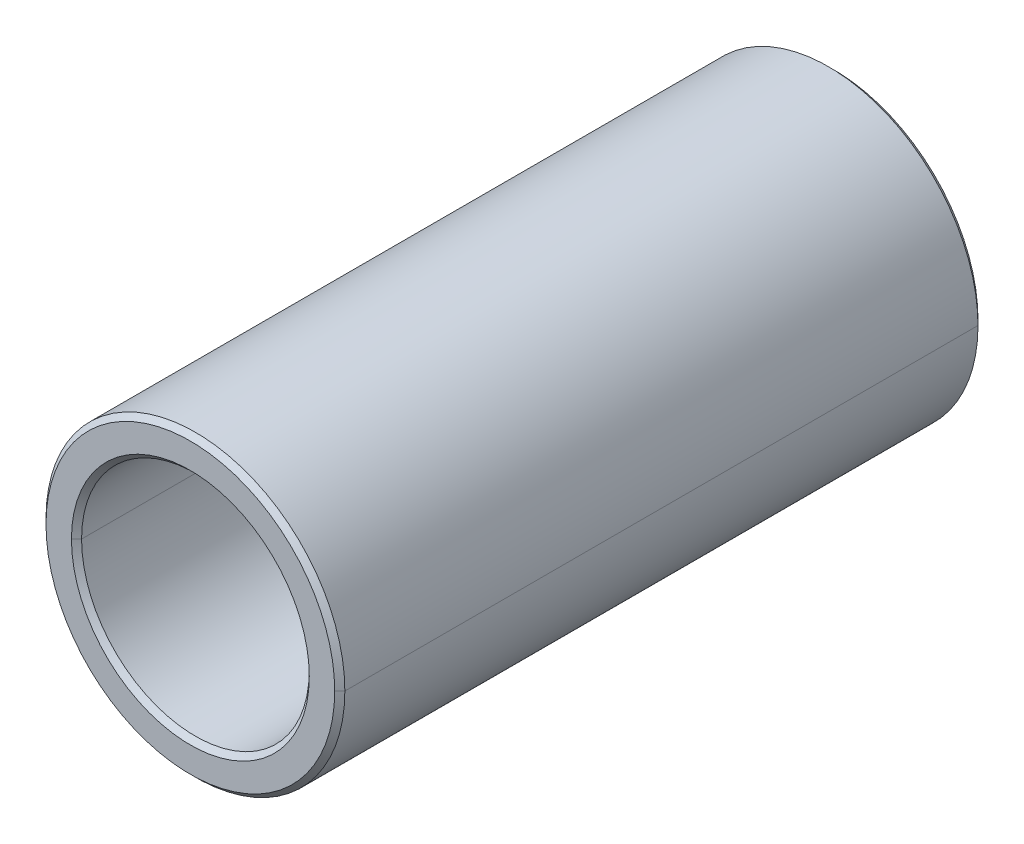
ISO-10303-21;
HEADER;
FILE_DESCRIPTION(('STEP AP214'),'2;1');
FILE_NAME('part.step','',(''),(''),'','','');
FILE_SCHEMA(('AUTOMOTIVE_DESIGN { 1 0 10303 214 1 1 1 1 }'));
ENDSEC;
DATA;
#1=APPLICATION_CONTEXT('core data for automotive mechanical design processes');
#2=APPLICATION_PROTOCOL_DEFINITION('international standard','automotive_design',2000,#1);
#3=PRODUCT_CONTEXT('',#1,'mechanical');
#4=PRODUCT('Part','Part','',(#3));
#5=PRODUCT_RELATED_PRODUCT_CATEGORY('part','',(#4));
#6=PRODUCT_DEFINITION_FORMATION('','',#4);
#7=PRODUCT_DEFINITION_CONTEXT('part definition',#1,'design');
#8=PRODUCT_DEFINITION('design','',#6,#7);
#9=PRODUCT_DEFINITION_SHAPE('','',#8);
#10=(LENGTH_UNIT() NAMED_UNIT(*) SI_UNIT(.MILLI.,.METRE.));
#11=(NAMED_UNIT(*) PLANE_ANGLE_UNIT() SI_UNIT($,.RADIAN.));
#12=(NAMED_UNIT(*) SI_UNIT($,.STERADIAN.) SOLID_ANGLE_UNIT());
#13=UNCERTAINTY_MEASURE_WITH_UNIT(LENGTH_MEASURE(1.E-05),#10,'distance_accuracy_value','');
#14=(GEOMETRIC_REPRESENTATION_CONTEXT(3) GLOBAL_UNCERTAINTY_ASSIGNED_CONTEXT((#13)) GLOBAL_UNIT_ASSIGNED_CONTEXT((#10,
#11,#12)) REPRESENTATION_CONTEXT('',''));
#15=CARTESIAN_POINT('',(0.,0.,0.));
#16=DIRECTION('',(0.,0.,1.));
#17=DIRECTION('',(1.,0.,0.));
#18=AXIS2_PLACEMENT_3D('',#15,#16,#17);
#19=CARTESIAN_POINT('',(0.,0.,6.35));
#20=DIRECTION('',(0.,0.,-1.));
#21=DIRECTION('',(-1.,0.,0.));
#22=AXIS2_PLACEMENT_3D('',#19,#20,#21);
#23=CONICAL_SURFACE('',#22,2.85,0.785398163397459);
#24=DIRECTION('',(0.707106781186555,0.,-0.70710678118654));
#25=VECTOR('',#24,1.);
#26=CARTESIAN_POINT('',(2.85,0.,6.35));
#27=LINE('',#26,#25);
#28=CARTESIAN_POINT('',(2.85,0.,6.35));
#29=VERTEX_POINT('',#28);
#30=CARTESIAN_POINT('',(2.95,0.,6.25));
#31=VERTEX_POINT('',#30);
#32=EDGE_CURVE('E174',#29,#31,#27,.T.);
#33=ORIENTED_EDGE('',*,*,#32,.F.);
#34=CARTESIAN_POINT('',(0.,0.,6.35));
#35=DIRECTION('',(0.,0.,1.));
#36=DIRECTION('',(-1.,0.,0.));
#37=AXIS2_PLACEMENT_3D('',#34,#35,#36);
#38=CIRCLE('',#37,2.85);
#39=CARTESIAN_POINT('',(-2.85,0.,6.35));
#40=VERTEX_POINT('',#39);
#41=EDGE_CURVE('E183',#40,#29,#38,.T.);
#42=ORIENTED_EDGE('',*,*,#41,.F.);
#43=DIRECTION('',(-0.707106781186555,0.,-0.70710678118654));
#44=VECTOR('',#43,1.);
#45=CARTESIAN_POINT('',(-2.85,0.,6.35));
#46=LINE('',#45,#44);
#47=CARTESIAN_POINT('',(-2.95,0.,6.25));
#48=VERTEX_POINT('',#47);
#49=EDGE_CURVE('E152',#40,#48,#46,.T.);
#50=ORIENTED_EDGE('',*,*,#49,.T.);
#51=CARTESIAN_POINT('',(0.,0.,6.25));
#52=DIRECTION('',(0.,0.,-1.));
#53=DIRECTION('',(-1.,0.,0.));
#54=AXIS2_PLACEMENT_3D('',#51,#52,#53);
#55=CIRCLE('',#54,2.95);
#56=EDGE_CURVE('E11',#31,#48,#55,.T.);
#57=ORIENTED_EDGE('',*,*,#56,.F.);
#58=EDGE_LOOP('',(#33,#42,#50,#57));
#59=FACE_BOUND('',#58,.T.);
#60=ADVANCED_FACE('F17',(#59),#23,.T.);
#61=CARTESIAN_POINT('',(0.,0.,6.25));
#62=DIRECTION('',(0.,0.,1.));
#63=DIRECTION('',(1.,0.,0.));
#64=AXIS2_PLACEMENT_3D('',#61,#62,#63);
#65=CONICAL_SURFACE('',#64,2.2479,0.785398163397452);
#66=DIRECTION('',(-0.707106781186551,0.,0.707106781186545));
#67=VECTOR('',#66,1.);
#68=CARTESIAN_POINT('',(-2.2479,0.,6.25));
#69=LINE('',#68,#67);
#70=CARTESIAN_POINT('',(-2.2479,0.,6.25));
#71=VERTEX_POINT('',#70);
#72=CARTESIAN_POINT('',(-2.3479,0.,6.35));
#73=VERTEX_POINT('',#72);
#74=EDGE_CURVE('E184',#71,#73,#69,.T.);
#75=ORIENTED_EDGE('',*,*,#74,.F.);
#76=CARTESIAN_POINT('',(0.,0.,6.25));
#77=DIRECTION('',(0.,0.,1.));
#78=DIRECTION('',(-1.,0.,0.));
#79=AXIS2_PLACEMENT_3D('',#76,#77,#78);
#80=CIRCLE('',#79,2.2479);
#81=CARTESIAN_POINT('',(2.2479,0.,6.25));
#82=VERTEX_POINT('',#81);
#83=EDGE_CURVE('E172',#82,#71,#80,.T.);
#84=ORIENTED_EDGE('',*,*,#83,.F.);
#85=DIRECTION('',(0.707106781186551,0.,0.707106781186545));
#86=VECTOR('',#85,1.);
#87=CARTESIAN_POINT('',(2.2479,0.,6.25));
#88=LINE('',#87,#86);
#89=CARTESIAN_POINT('',(2.3479,0.,6.35));
#90=VERTEX_POINT('',#89);
#91=EDGE_CURVE('E140',#82,#90,#88,.T.);
#92=ORIENTED_EDGE('',*,*,#91,.T.);
#93=CARTESIAN_POINT('',(0.,0.,6.35));
#94=DIRECTION('',(0.,0.,-1.));
#95=DIRECTION('',(-1.,0.,0.));
#96=AXIS2_PLACEMENT_3D('',#93,#94,#95);
#97=CIRCLE('',#96,2.3479);
#98=EDGE_CURVE('E179',#73,#90,#97,.T.);
#99=ORIENTED_EDGE('',*,*,#98,.F.);
#100=EDGE_LOOP('',(#75,#84,#92,#99));
#101=FACE_BOUND('',#100,.T.);
#102=ADVANCED_FACE('F352',(#101),#65,.F.);
#103=CARTESIAN_POINT('',(0.,0.,-6.25));
#104=DIRECTION('',(0.,0.,1.));
#105=DIRECTION('',(1.,0.,0.));
#106=AXIS2_PLACEMENT_3D('',#103,#104,#105);
#107=CONICAL_SURFACE('',#106,2.95,0.785398163397443);
#108=DIRECTION('',(-0.707106781186545,0.,0.707106781186551));
#109=VECTOR('',#108,1.);
#110=CARTESIAN_POINT('',(-2.95,0.,-6.25));
#111=LINE('',#110,#109);
#112=CARTESIAN_POINT('',(-2.85,0.,-6.35));
#113=VERTEX_POINT('',#112);
#114=CARTESIAN_POINT('',(-2.95,0.,-6.25));
#115=VERTEX_POINT('',#114);
#116=EDGE_CURVE('E109',#113,#115,#111,.T.);
#117=ORIENTED_EDGE('',*,*,#116,.F.);
#118=CARTESIAN_POINT('',(0.,0.,-6.35));
#119=DIRECTION('',(0.,0.,-1.));
#120=DIRECTION('',(1.,0.,0.));
#121=AXIS2_PLACEMENT_3D('',#118,#119,#120);
#122=CIRCLE('',#121,2.85);
#123=CARTESIAN_POINT('',(2.85,0.,-6.35));
#124=VERTEX_POINT('',#123);
#125=EDGE_CURVE('E148',#124,#113,#122,.T.);
#126=ORIENTED_EDGE('',*,*,#125,.F.);
#127=DIRECTION('',(0.707106781186545,0.,0.707106781186551));
#128=VECTOR('',#127,1.);
#129=CARTESIAN_POINT('',(2.95,0.,-6.25));
#130=LINE('',#129,#128);
#131=CARTESIAN_POINT('',(2.95,0.,-6.25));
#132=VERTEX_POINT('',#131);
#133=EDGE_CURVE('E112',#124,#132,#130,.T.);
#134=ORIENTED_EDGE('',*,*,#133,.T.);
#135=CARTESIAN_POINT('',(0.,0.,-6.25));
#136=DIRECTION('',(0.,0.,1.));
#137=DIRECTION('',(1.,0.,0.));
#138=AXIS2_PLACEMENT_3D('',#135,#136,#137);
#139=CIRCLE('',#138,2.95);
#140=EDGE_CURVE('E28',#115,#132,#139,.T.);
#141=ORIENTED_EDGE('',*,*,#140,.F.);
#142=EDGE_LOOP('',(#117,#126,#134,#141));
#143=FACE_BOUND('',#142,.T.);
#144=ADVANCED_FACE('F107',(#143),#107,.T.);
#145=CARTESIAN_POINT('',(0.,0.,-6.35));
#146=DIRECTION('',(0.,0.,-1.));
#147=DIRECTION('',(-1.,0.,0.));
#148=AXIS2_PLACEMENT_3D('',#145,#146,#147);
#149=CONICAL_SURFACE('',#148,2.3479,0.785398163397443);
#150=DIRECTION('',(0.707106781186545,0.,-0.707106781186551));
#151=VECTOR('',#150,1.);
#152=CARTESIAN_POINT('',(2.3479,0.,-6.35));
#153=LINE('',#152,#151);
#154=CARTESIAN_POINT('',(2.2479,0.,-6.25));
#155=VERTEX_POINT('',#154);
#156=CARTESIAN_POINT('',(2.3479,0.,-6.35));
#157=VERTEX_POINT('',#156);
#158=EDGE_CURVE('E164',#155,#157,#153,.T.);
#159=ORIENTED_EDGE('',*,*,#158,.F.);
#160=CARTESIAN_POINT('',(0.,0.,-6.25));
#161=DIRECTION('',(0.,0.,-1.));
#162=DIRECTION('',(1.,0.,0.));
#163=AXIS2_PLACEMENT_3D('',#160,#161,#162);
#164=CIRCLE('',#163,2.2479);
#165=CARTESIAN_POINT('',(-2.2479,0.,-6.25));
#166=VERTEX_POINT('',#165);
#167=EDGE_CURVE('E182',#166,#155,#164,.T.);
#168=ORIENTED_EDGE('',*,*,#167,.F.);
#169=DIRECTION('',(-0.707106781186545,0.,-0.707106781186551));
#170=VECTOR('',#169,1.);
#171=CARTESIAN_POINT('',(-2.3479,0.,-6.35));
#172=LINE('',#171,#170);
#173=CARTESIAN_POINT('',(-2.3479,0.,-6.35));
#174=VERTEX_POINT('',#173);
#175=EDGE_CURVE('E124',#166,#174,#172,.T.);
#176=ORIENTED_EDGE('',*,*,#175,.T.);
#177=CARTESIAN_POINT('',(0.,0.,-6.35));
#178=DIRECTION('',(0.,0.,1.));
#179=DIRECTION('',(1.,0.,0.));
#180=AXIS2_PLACEMENT_3D('',#177,#178,#179);
#181=CIRCLE('',#180,2.3479);
#182=EDGE_CURVE('E42',#157,#174,#181,.T.);
#183=ORIENTED_EDGE('',*,*,#182,.F.);
#184=EDGE_LOOP('',(#159,#168,#176,#183));
#185=FACE_BOUND('',#184,.T.);
#186=ADVANCED_FACE('F351',(#185),#149,.F.);
#187=CARTESIAN_POINT('',(0.,0.,7.37616));
#188=DIRECTION('',(0.,0.,1.));
#189=DIRECTION('',(1.,0.,0.));
#190=AXIS2_PLACEMENT_3D('',#187,#188,#189);
#191=CYLINDRICAL_SURFACE('',#190,2.95);
#192=DIRECTION('',(0.,0.,1.));
#193=VECTOR('',#192,1.);
#194=CARTESIAN_POINT('',(-2.95,0.,7.37616));
#195=LINE('',#194,#193);
#196=EDGE_CURVE('E117',#115,#48,#195,.T.);
#197=ORIENTED_EDGE('',*,*,#196,.F.);
#198=ORIENTED_EDGE('',*,*,#140,.T.);
#199=DIRECTION('',(0.,0.,1.));
#200=VECTOR('',#199,1.);
#201=CARTESIAN_POINT('',(2.95,0.,7.37616));
#202=LINE('',#201,#200);
#203=EDGE_CURVE('E21',#132,#31,#202,.T.);
#204=ORIENTED_EDGE('',*,*,#203,.T.);
#205=ORIENTED_EDGE('',*,*,#56,.T.);
#206=EDGE_LOOP('',(#197,#198,#204,#205));
#207=FACE_BOUND('',#206,.T.);
#208=ADVANCED_FACE('F119',(#207),#191,.T.);
#209=CARTESIAN_POINT('',(0.,2.95,-6.35));
#210=DIRECTION('',(0.,0.,1.));
#211=DIRECTION('',(1.,0.,0.));
#212=AXIS2_PLACEMENT_3D('',#209,#210,#211);
#213=PLANE('',#212);
#214=CARTESIAN_POINT('',(0.,0.,-6.35));
#215=DIRECTION('',(0.,0.,1.));
#216=DIRECTION('',(1.,0.,0.));
#217=AXIS2_PLACEMENT_3D('',#214,#215,#216);
#218=CIRCLE('',#217,2.3479);
#219=EDGE_CURVE('E157',#174,#157,#218,.T.);
#220=ORIENTED_EDGE('',*,*,#219,.T.);
#221=ORIENTED_EDGE('',*,*,#182,.T.);
#222=EDGE_LOOP('',(#220,#221));
#223=FACE_BOUND('',#222,.T.);
#224=ORIENTED_EDGE('',*,*,#125,.T.);
#225=CARTESIAN_POINT('',(0.,0.,-6.35));
#226=DIRECTION('',(0.,0.,-1.));
#227=DIRECTION('',(1.,0.,0.));
#228=AXIS2_PLACEMENT_3D('',#225,#226,#227);
#229=CIRCLE('',#228,2.85);
#230=EDGE_CURVE('E133',#113,#124,#229,.T.);
#231=ORIENTED_EDGE('',*,*,#230,.T.);
#232=EDGE_LOOP('',(#224,#231));
#233=FACE_BOUND('',#232,.T.);
#234=ADVANCED_FACE('F386',(#223,#233),#213,.F.);
#235=CARTESIAN_POINT('',(0.,0.,7.37616));
#236=DIRECTION('',(0.,0.,1.));
#237=DIRECTION('',(1.,0.,0.));
#238=AXIS2_PLACEMENT_3D('',#235,#236,#237);
#239=CYLINDRICAL_SURFACE('',#238,2.2479);
#240=DIRECTION('',(0.,0.,1.));
#241=VECTOR('',#240,1.);
#242=CARTESIAN_POINT('',(-2.2479,0.,7.37616));
#243=LINE('',#242,#241);
#244=EDGE_CURVE('E202',#166,#71,#243,.T.);
#245=ORIENTED_EDGE('',*,*,#244,.F.);
#246=ORIENTED_EDGE('',*,*,#167,.T.);
#247=DIRECTION('',(0.,0.,1.));
#248=VECTOR('',#247,1.);
#249=CARTESIAN_POINT('',(2.2479,0.,7.37616));
#250=LINE('',#249,#248);
#251=EDGE_CURVE('E144',#155,#82,#250,.T.);
#252=ORIENTED_EDGE('',*,*,#251,.T.);
#253=ORIENTED_EDGE('',*,*,#83,.T.);
#254=EDGE_LOOP('',(#245,#246,#252,#253));
#255=FACE_BOUND('',#254,.T.);
#256=ADVANCED_FACE('F368',(#255),#239,.F.);
#257=CARTESIAN_POINT('',(0.,2.95,6.35));
#258=DIRECTION('',(0.,0.,-1.));
#259=DIRECTION('',(0.,-1.,0.));
#260=AXIS2_PLACEMENT_3D('',#257,#258,#259);
#261=PLANE('',#260);
#262=CARTESIAN_POINT('',(0.,0.,6.35));
#263=DIRECTION('',(0.,0.,-1.));
#264=DIRECTION('',(-1.,0.,0.));
#265=AXIS2_PLACEMENT_3D('',#262,#263,#264);
#266=CIRCLE('',#265,2.3479);
#267=EDGE_CURVE('E188',#90,#73,#266,.T.);
#268=ORIENTED_EDGE('',*,*,#267,.T.);
#269=ORIENTED_EDGE('',*,*,#98,.T.);
#270=EDGE_LOOP('',(#268,#269));
#271=FACE_BOUND('',#270,.T.);
#272=ORIENTED_EDGE('',*,*,#41,.T.);
#273=CARTESIAN_POINT('',(0.,0.,6.35));
#274=DIRECTION('',(0.,0.,1.));
#275=DIRECTION('',(-1.,0.,0.));
#276=AXIS2_PLACEMENT_3D('',#273,#274,#275);
#277=CIRCLE('',#276,2.85);
#278=EDGE_CURVE('E178',#29,#40,#277,.T.);
#279=ORIENTED_EDGE('',*,*,#278,.T.);
#280=EDGE_LOOP('',(#272,#279));
#281=FACE_BOUND('',#280,.T.);
#282=ADVANCED_FACE('F213',(#271,#281),#261,.F.);
#283=CARTESIAN_POINT('',(0.,0.,7.37616));
#284=DIRECTION('',(0.,0.,1.));
#285=DIRECTION('',(1.,0.,0.));
#286=AXIS2_PLACEMENT_3D('',#283,#284,#285);
#287=CYLINDRICAL_SURFACE('',#286,2.2479);
#288=CARTESIAN_POINT('',(0.,0.,-6.25));
#289=DIRECTION('',(0.,0.,-1.));
#290=DIRECTION('',(1.,0.,0.));
#291=AXIS2_PLACEMENT_3D('',#288,#289,#290);
#292=CIRCLE('',#291,2.2479);
#293=EDGE_CURVE('E151',#155,#166,#292,.T.);
#294=ORIENTED_EDGE('',*,*,#293,.T.);
#295=ORIENTED_EDGE('',*,*,#244,.T.);
#296=CARTESIAN_POINT('',(0.,0.,6.25));
#297=DIRECTION('',(0.,0.,1.));
#298=DIRECTION('',(-1.,0.,0.));
#299=AXIS2_PLACEMENT_3D('',#296,#297,#298);
#300=CIRCLE('',#299,2.2479);
#301=EDGE_CURVE('E154',#71,#82,#300,.T.);
#302=ORIENTED_EDGE('',*,*,#301,.T.);
#303=ORIENTED_EDGE('',*,*,#251,.F.);
#304=EDGE_LOOP('',(#294,#295,#302,#303));
#305=FACE_BOUND('',#304,.T.);
#306=ADVANCED_FACE('F367',(#305),#287,.F.);
#307=CARTESIAN_POINT('',(0.,0.,7.37616));
#308=DIRECTION('',(0.,0.,1.));
#309=DIRECTION('',(1.,0.,0.));
#310=AXIS2_PLACEMENT_3D('',#307,#308,#309);
#311=CYLINDRICAL_SURFACE('',#310,2.95);
#312=CARTESIAN_POINT('',(0.,0.,-6.25));
#313=DIRECTION('',(0.,0.,1.));
#314=DIRECTION('',(1.,0.,0.));
#315=AXIS2_PLACEMENT_3D('',#312,#313,#314);
#316=CIRCLE('',#315,2.95);
#317=EDGE_CURVE('E126',#132,#115,#316,.T.);
#318=ORIENTED_EDGE('',*,*,#317,.T.);
#319=ORIENTED_EDGE('',*,*,#196,.T.);
#320=CARTESIAN_POINT('',(0.,0.,6.25));
#321=DIRECTION('',(0.,0.,-1.));
#322=DIRECTION('',(-1.,0.,0.));
#323=AXIS2_PLACEMENT_3D('',#320,#321,#322);
#324=CIRCLE('',#323,2.95);
#325=EDGE_CURVE('E155',#48,#31,#324,.T.);
#326=ORIENTED_EDGE('',*,*,#325,.T.);
#327=ORIENTED_EDGE('',*,*,#203,.F.);
#328=EDGE_LOOP('',(#318,#319,#326,#327));
#329=FACE_BOUND('',#328,.T.);
#330=ADVANCED_FACE('F127',(#329),#311,.T.);
#331=CARTESIAN_POINT('',(0.,0.,-6.35));
#332=DIRECTION('',(0.,0.,-1.));
#333=DIRECTION('',(-1.,0.,0.));
#334=AXIS2_PLACEMENT_3D('',#331,#332,#333);
#335=CONICAL_SURFACE('',#334,2.3479,0.785398163397443);
#336=ORIENTED_EDGE('',*,*,#293,.F.);
#337=ORIENTED_EDGE('',*,*,#158,.T.);
#338=ORIENTED_EDGE('',*,*,#219,.F.);
#339=ORIENTED_EDGE('',*,*,#175,.F.);
#340=EDGE_LOOP('',(#336,#337,#338,#339));
#341=FACE_BOUND('',#340,.T.);
#342=ADVANCED_FACE('F19',(#341),#335,.F.);
#343=CARTESIAN_POINT('',(0.,0.,-6.25));
#344=DIRECTION('',(0.,0.,1.));
#345=DIRECTION('',(1.,0.,0.));
#346=AXIS2_PLACEMENT_3D('',#343,#344,#345);
#347=CONICAL_SURFACE('',#346,2.95,0.785398163397443);
#348=ORIENTED_EDGE('',*,*,#230,.F.);
#349=ORIENTED_EDGE('',*,*,#116,.T.);
#350=ORIENTED_EDGE('',*,*,#317,.F.);
#351=ORIENTED_EDGE('',*,*,#133,.F.);
#352=EDGE_LOOP('',(#348,#349,#350,#351));
#353=FACE_BOUND('',#352,.T.);
#354=ADVANCED_FACE('F131',(#353),#347,.T.);
#355=CARTESIAN_POINT('',(0.,0.,6.25));
#356=DIRECTION('',(0.,0.,1.));
#357=DIRECTION('',(1.,0.,0.));
#358=AXIS2_PLACEMENT_3D('',#355,#356,#357);
#359=CONICAL_SURFACE('',#358,2.2479,0.785398163397452);
#360=ORIENTED_EDGE('',*,*,#301,.F.);
#361=ORIENTED_EDGE('',*,*,#74,.T.);
#362=ORIENTED_EDGE('',*,*,#267,.F.);
#363=ORIENTED_EDGE('',*,*,#91,.F.);
#364=EDGE_LOOP('',(#360,#361,#362,#363));
#365=FACE_BOUND('',#364,.T.);
#366=ADVANCED_FACE('F374',(#365),#359,.F.);
#367=CARTESIAN_POINT('',(0.,0.,6.35));
#368=DIRECTION('',(0.,0.,-1.));
#369=DIRECTION('',(-1.,0.,0.));
#370=AXIS2_PLACEMENT_3D('',#367,#368,#369);
#371=CONICAL_SURFACE('',#370,2.85,0.785398163397459);
#372=ORIENTED_EDGE('',*,*,#278,.F.);
#373=ORIENTED_EDGE('',*,*,#32,.T.);
#374=ORIENTED_EDGE('',*,*,#325,.F.);
#375=ORIENTED_EDGE('',*,*,#49,.F.);
#376=EDGE_LOOP('',(#372,#373,#374,#375));
#377=FACE_BOUND('',#376,.T.);
#378=ADVANCED_FACE('F218',(#377),#371,.T.);
#379=CLOSED_SHELL('',(#60,#102,#144,#186,#208,#234,#256,#282,#306,#330,#342,#354,#366,#378));
#380=MANIFOLD_SOLID_BREP('B1',#379);
#381=ADVANCED_BREP_SHAPE_REPRESENTATION('',(#18,#380),#14);
#382=SHAPE_DEFINITION_REPRESENTATION(#9,#381);
ENDSEC;
END-ISO-10303-21;
